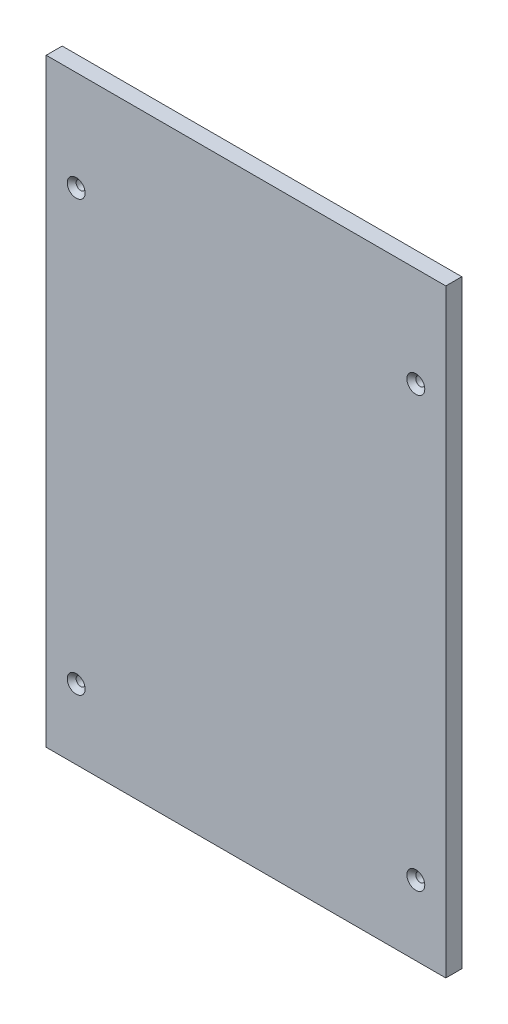
ISO-10303-21;
HEADER;
FILE_DESCRIPTION(('STEP AP214'),'2;1');
FILE_NAME('part.step','',(''),(''),'','','');
FILE_SCHEMA(('AUTOMOTIVE_DESIGN { 1 0 10303 214 1 1 1 1 }'));
ENDSEC;
DATA;
#1=APPLICATION_CONTEXT('core data for automotive mechanical design processes');
#2=APPLICATION_PROTOCOL_DEFINITION('international standard','automotive_design',2000,#1);
#3=PRODUCT_CONTEXT('',#1,'mechanical');
#4=PRODUCT('Part','Part','',(#3));
#5=PRODUCT_RELATED_PRODUCT_CATEGORY('part','',(#4));
#6=PRODUCT_DEFINITION_FORMATION('','',#4);
#7=PRODUCT_DEFINITION_CONTEXT('part definition',#1,'design');
#8=PRODUCT_DEFINITION('design','',#6,#7);
#9=PRODUCT_DEFINITION_SHAPE('','',#8);
#10=(LENGTH_UNIT() NAMED_UNIT(*) SI_UNIT(.MILLI.,.METRE.));
#11=(NAMED_UNIT(*) PLANE_ANGLE_UNIT() SI_UNIT($,.RADIAN.));
#12=(NAMED_UNIT(*) SI_UNIT($,.STERADIAN.) SOLID_ANGLE_UNIT());
#13=UNCERTAINTY_MEASURE_WITH_UNIT(LENGTH_MEASURE(1.E-05),#10,'distance_accuracy_value','');
#14=(GEOMETRIC_REPRESENTATION_CONTEXT(3) GLOBAL_UNCERTAINTY_ASSIGNED_CONTEXT((#13)) GLOBAL_UNIT_ASSIGNED_CONTEXT((#10,
#11,#12)) REPRESENTATION_CONTEXT('',''));
#15=CARTESIAN_POINT('',(0.,0.,0.));
#16=DIRECTION('',(0.,0.,1.));
#17=DIRECTION('',(1.,0.,0.));
#18=AXIS2_PLACEMENT_3D('',#15,#16,#17);
#19=CARTESIAN_POINT('',(0.,0.,8.));
#20=DIRECTION('',(1.,0.,0.));
#21=DIRECTION('',(0.,0.,-1.));
#22=AXIS2_PLACEMENT_3D('',#19,#20,#21);
#23=PLANE('',#22);
#24=DIRECTION('',(0.,-1.,0.));
#25=VECTOR('',#24,1.);
#26=CARTESIAN_POINT('',(0.,0.,0.));
#27=LINE('',#26,#25);
#28=CARTESIAN_POINT('',(0.,300.,0.));
#29=VERTEX_POINT('',#28);
#30=CARTESIAN_POINT('',(0.,0.,0.));
#31=VERTEX_POINT('',#30);
#32=EDGE_CURVE('E96',#29,#31,#27,.T.);
#33=ORIENTED_EDGE('',*,*,#32,.T.);
#34=DIRECTION('',(0.,0.,-1.));
#35=VECTOR('',#34,1.);
#36=CARTESIAN_POINT('',(0.,0.,8.));
#37=LINE('',#36,#35);
#38=CARTESIAN_POINT('',(0.,0.,8.));
#39=VERTEX_POINT('',#38);
#40=EDGE_CURVE('E11',#39,#31,#37,.T.);
#41=ORIENTED_EDGE('',*,*,#40,.F.);
#42=DIRECTION('',(0.,-1.,0.));
#43=VECTOR('',#42,1.);
#44=CARTESIAN_POINT('',(0.,0.,8.));
#45=LINE('',#44,#43);
#46=CARTESIAN_POINT('',(0.,300.,8.));
#47=VERTEX_POINT('',#46);
#48=EDGE_CURVE('E84',#47,#39,#45,.T.);
#49=ORIENTED_EDGE('',*,*,#48,.F.);
#50=DIRECTION('',(0.,0.,-1.));
#51=VECTOR('',#50,1.);
#52=CARTESIAN_POINT('',(0.,300.,8.));
#53=LINE('',#52,#51);
#54=EDGE_CURVE('E92',#47,#29,#53,.T.);
#55=ORIENTED_EDGE('',*,*,#54,.T.);
#56=EDGE_LOOP('',(#33,#41,#49,#55));
#57=FACE_BOUND('',#56,.T.);
#58=ADVANCED_FACE('F33',(#57),#23,.F.);
#59=CARTESIAN_POINT('',(0.,0.,8.));
#60=DIRECTION('',(0.,1.,0.));
#61=DIRECTION('',(0.,0.,1.));
#62=AXIS2_PLACEMENT_3D('',#59,#60,#61);
#63=PLANE('',#62);
#64=DIRECTION('',(1.,0.,0.));
#65=VECTOR('',#64,1.);
#66=CARTESIAN_POINT('',(0.,0.,0.));
#67=LINE('',#66,#65);
#68=CARTESIAN_POINT('',(200.,0.,0.));
#69=VERTEX_POINT('',#68);
#70=EDGE_CURVE('E88',#31,#69,#67,.T.);
#71=ORIENTED_EDGE('',*,*,#70,.T.);
#72=DIRECTION('',(0.,0.,-1.));
#73=VECTOR('',#72,1.);
#74=CARTESIAN_POINT('',(200.,0.,8.));
#75=LINE('',#74,#73);
#76=CARTESIAN_POINT('',(200.,0.,8.));
#77=VERTEX_POINT('',#76);
#78=EDGE_CURVE('E41',#77,#69,#75,.T.);
#79=ORIENTED_EDGE('',*,*,#78,.F.);
#80=DIRECTION('',(1.,0.,0.));
#81=VECTOR('',#80,1.);
#82=CARTESIAN_POINT('',(0.,0.,8.));
#83=LINE('',#82,#81);
#84=EDGE_CURVE('E79',#39,#77,#83,.T.);
#85=ORIENTED_EDGE('',*,*,#84,.F.);
#86=ORIENTED_EDGE('',*,*,#40,.T.);
#87=EDGE_LOOP('',(#71,#79,#85,#86));
#88=FACE_BOUND('',#87,.T.);
#89=ADVANCED_FACE('F87',(#88),#63,.F.);
#90=CARTESIAN_POINT('',(200.,0.,8.));
#91=DIRECTION('',(-1.,0.,0.));
#92=DIRECTION('',(0.,0.,1.));
#93=AXIS2_PLACEMENT_3D('',#90,#91,#92);
#94=PLANE('',#93);
#95=DIRECTION('',(0.,1.,0.));
#96=VECTOR('',#95,1.);
#97=CARTESIAN_POINT('',(200.,0.,0.));
#98=LINE('',#97,#96);
#99=CARTESIAN_POINT('',(200.,300.,0.));
#100=VERTEX_POINT('',#99);
#101=EDGE_CURVE('E66',#69,#100,#98,.T.);
#102=ORIENTED_EDGE('',*,*,#101,.T.);
#103=DIRECTION('',(0.,0.,-1.));
#104=VECTOR('',#103,1.);
#105=CARTESIAN_POINT('',(200.,300.,8.));
#106=LINE('',#105,#104);
#107=CARTESIAN_POINT('',(200.,300.,8.));
#108=VERTEX_POINT('',#107);
#109=EDGE_CURVE('E89',#108,#100,#106,.T.);
#110=ORIENTED_EDGE('',*,*,#109,.F.);
#111=DIRECTION('',(0.,1.,0.));
#112=VECTOR('',#111,1.);
#113=CARTESIAN_POINT('',(200.,0.,8.));
#114=LINE('',#113,#112);
#115=EDGE_CURVE('E82',#77,#108,#114,.T.);
#116=ORIENTED_EDGE('',*,*,#115,.F.);
#117=ORIENTED_EDGE('',*,*,#78,.T.);
#118=EDGE_LOOP('',(#102,#110,#116,#117));
#119=FACE_BOUND('',#118,.T.);
#120=ADVANCED_FACE('F90',(#119),#94,.F.);
#121=CARTESIAN_POINT('',(0.,300.,8.));
#122=DIRECTION('',(0.,-1.,0.));
#123=DIRECTION('',(0.,0.,-1.));
#124=AXIS2_PLACEMENT_3D('',#121,#122,#123);
#125=PLANE('',#124);
#126=DIRECTION('',(-1.,0.,0.));
#127=VECTOR('',#126,1.);
#128=CARTESIAN_POINT('',(0.,300.,0.));
#129=LINE('',#128,#127);
#130=EDGE_CURVE('E72',#100,#29,#129,.T.);
#131=ORIENTED_EDGE('',*,*,#130,.T.);
#132=ORIENTED_EDGE('',*,*,#54,.F.);
#133=DIRECTION('',(-1.,0.,0.));
#134=VECTOR('',#133,1.);
#135=CARTESIAN_POINT('',(0.,300.,8.));
#136=LINE('',#135,#134);
#137=EDGE_CURVE('E49',#108,#47,#136,.T.);
#138=ORIENTED_EDGE('',*,*,#137,.F.);
#139=ORIENTED_EDGE('',*,*,#109,.T.);
#140=EDGE_LOOP('',(#131,#132,#138,#139));
#141=FACE_BOUND('',#140,.T.);
#142=ADVANCED_FACE('F104',(#141),#125,.F.);
#143=CARTESIAN_POINT('',(0.,0.,8.));
#144=DIRECTION('',(0.,0.,-1.));
#145=DIRECTION('',(-1.,0.,0.));
#146=AXIS2_PLACEMENT_3D('',#143,#144,#145);
#147=PLANE('',#146);
#148=CARTESIAN_POINT('',(15.,250.,8.));
#149=DIRECTION('',(0.,0.,1.));
#150=DIRECTION('',(1.,0.,0.));
#151=AXIS2_PLACEMENT_3D('',#148,#149,#150);
#152=CIRCLE('',#151,4.48);
#153=CARTESIAN_POINT('',(19.48,250.,8.));
#154=VERTEX_POINT('',#153);
#155=EDGE_CURVE('E142',#154,#154,#152,.T.);
#156=ORIENTED_EDGE('',*,*,#155,.F.);
#157=EDGE_LOOP('',(#156));
#158=FACE_BOUND('',#157,.T.);
#159=CARTESIAN_POINT('',(185.,250.,8.));
#160=DIRECTION('',(0.,0.,1.));
#161=DIRECTION('',(1.,0.,0.));
#162=AXIS2_PLACEMENT_3D('',#159,#160,#161);
#163=CIRCLE('',#162,4.48000000000001);
#164=CARTESIAN_POINT('',(189.48,250.,8.));
#165=VERTEX_POINT('',#164);
#166=EDGE_CURVE('E133',#165,#165,#163,.T.);
#167=ORIENTED_EDGE('',*,*,#166,.F.);
#168=EDGE_LOOP('',(#167));
#169=FACE_BOUND('',#168,.T.);
#170=CARTESIAN_POINT('',(15.,35.,8.));
#171=DIRECTION('',(0.,0.,1.));
#172=DIRECTION('',(1.,0.,0.));
#173=AXIS2_PLACEMENT_3D('',#170,#171,#172);
#174=CIRCLE('',#173,4.48);
#175=CARTESIAN_POINT('',(19.48,35.,8.));
#176=VERTEX_POINT('',#175);
#177=EDGE_CURVE('E124',#176,#176,#174,.T.);
#178=ORIENTED_EDGE('',*,*,#177,.F.);
#179=EDGE_LOOP('',(#178));
#180=FACE_BOUND('',#179,.T.);
#181=CARTESIAN_POINT('',(185.,35.,8.));
#182=DIRECTION('',(0.,0.,1.));
#183=DIRECTION('',(1.,0.,0.));
#184=AXIS2_PLACEMENT_3D('',#181,#182,#183);
#185=CIRCLE('',#184,4.48000000000001);
#186=CARTESIAN_POINT('',(189.48,35.,8.));
#187=VERTEX_POINT('',#186);
#188=EDGE_CURVE('E115',#187,#187,#185,.T.);
#189=ORIENTED_EDGE('',*,*,#188,.F.);
#190=EDGE_LOOP('',(#189));
#191=FACE_BOUND('',#190,.T.);
#192=ORIENTED_EDGE('',*,*,#48,.T.);
#193=ORIENTED_EDGE('',*,*,#84,.T.);
#194=ORIENTED_EDGE('',*,*,#115,.T.);
#195=ORIENTED_EDGE('',*,*,#137,.T.);
#196=EDGE_LOOP('',(#192,#193,#194,#195));
#197=FACE_BOUND('',#196,.T.);
#198=ADVANCED_FACE('F80',(#158,#169,#180,#191,#197),#147,.F.);
#199=CARTESIAN_POINT('',(0.,0.,0.));
#200=DIRECTION('',(0.,0.,-1.));
#201=DIRECTION('',(-1.,0.,0.));
#202=AXIS2_PLACEMENT_3D('',#199,#200,#201);
#203=PLANE('',#202);
#204=CARTESIAN_POINT('',(15.,250.,0.));
#205=DIRECTION('',(0.,0.,1.));
#206=DIRECTION('',(1.,0.,0.));
#207=AXIS2_PLACEMENT_3D('',#204,#205,#206);
#208=CIRCLE('',#207,2.25);
#209=CARTESIAN_POINT('',(17.25,250.,0.));
#210=VERTEX_POINT('',#209);
#211=EDGE_CURVE('E136',#210,#210,#208,.T.);
#212=ORIENTED_EDGE('',*,*,#211,.T.);
#213=EDGE_LOOP('',(#212));
#214=FACE_BOUND('',#213,.T.);
#215=CARTESIAN_POINT('',(185.,250.,0.));
#216=DIRECTION('',(0.,0.,1.));
#217=DIRECTION('',(1.,0.,0.));
#218=AXIS2_PLACEMENT_3D('',#215,#216,#217);
#219=CIRCLE('',#218,2.25);
#220=CARTESIAN_POINT('',(187.25,250.,0.));
#221=VERTEX_POINT('',#220);
#222=EDGE_CURVE('E127',#221,#221,#219,.T.);
#223=ORIENTED_EDGE('',*,*,#222,.T.);
#224=EDGE_LOOP('',(#223));
#225=FACE_BOUND('',#224,.T.);
#226=CARTESIAN_POINT('',(15.,35.,0.));
#227=DIRECTION('',(0.,0.,1.));
#228=DIRECTION('',(1.,0.,0.));
#229=AXIS2_PLACEMENT_3D('',#226,#227,#228);
#230=CIRCLE('',#229,2.25);
#231=CARTESIAN_POINT('',(17.25,35.,0.));
#232=VERTEX_POINT('',#231);
#233=EDGE_CURVE('E118',#232,#232,#230,.T.);
#234=ORIENTED_EDGE('',*,*,#233,.T.);
#235=EDGE_LOOP('',(#234));
#236=FACE_BOUND('',#235,.T.);
#237=CARTESIAN_POINT('',(185.,35.,0.));
#238=DIRECTION('',(0.,0.,1.));
#239=DIRECTION('',(1.,0.,0.));
#240=AXIS2_PLACEMENT_3D('',#237,#238,#239);
#241=CIRCLE('',#240,2.25);
#242=CARTESIAN_POINT('',(187.25,35.,0.));
#243=VERTEX_POINT('',#242);
#244=EDGE_CURVE('E99',#243,#243,#241,.T.);
#245=ORIENTED_EDGE('',*,*,#244,.T.);
#246=EDGE_LOOP('',(#245));
#247=FACE_BOUND('',#246,.T.);
#248=ORIENTED_EDGE('',*,*,#32,.F.);
#249=ORIENTED_EDGE('',*,*,#130,.F.);
#250=ORIENTED_EDGE('',*,*,#101,.F.);
#251=ORIENTED_EDGE('',*,*,#70,.F.);
#252=EDGE_LOOP('',(#248,#249,#250,#251));
#253=FACE_BOUND('',#252,.T.);
#254=ADVANCED_FACE('F107',(#214,#225,#236,#247,#253),#203,.T.);
#255=CARTESIAN_POINT('',(185.,35.,8.));
#256=DIRECTION('',(0.,0.,1.));
#257=DIRECTION('',(1.,0.,0.));
#258=AXIS2_PLACEMENT_3D('',#255,#256,#257);
#259=CYLINDRICAL_SURFACE('',#258,2.25);
#260=ORIENTED_EDGE('',*,*,#244,.F.);
#261=EDGE_LOOP('',(#260));
#262=FACE_BOUND('',#261,.T.);
#263=CARTESIAN_POINT('',(185.,35.,5.77));
#264=DIRECTION('',(0.,0.,1.));
#265=DIRECTION('',(1.,0.,0.));
#266=AXIS2_PLACEMENT_3D('',#263,#264,#265);
#267=CIRCLE('',#266,2.25);
#268=CARTESIAN_POINT('',(187.25,35.,5.77));
#269=VERTEX_POINT('',#268);
#270=EDGE_CURVE('E112',#269,#269,#267,.T.);
#271=ORIENTED_EDGE('',*,*,#270,.T.);
#272=EDGE_LOOP('',(#271));
#273=FACE_BOUND('',#272,.T.);
#274=ADVANCED_FACE('F160',(#262,#273),#259,.F.);
#275=CARTESIAN_POINT('',(185.,35.,8.));
#276=DIRECTION('',(0.,0.,1.));
#277=DIRECTION('',(1.,0.,0.));
#278=AXIS2_PLACEMENT_3D('',#275,#276,#277);
#279=CONICAL_SURFACE('',#278,4.48000000000001,0.78539816339745);
#280=ORIENTED_EDGE('',*,*,#270,.F.);
#281=EDGE_LOOP('',(#280));
#282=FACE_BOUND('',#281,.T.);
#283=ORIENTED_EDGE('',*,*,#188,.T.);
#284=EDGE_LOOP('',(#283));
#285=FACE_BOUND('',#284,.T.);
#286=ADVANCED_FACE('F157',(#282,#285),#279,.F.);
#287=CARTESIAN_POINT('',(15.,35.,8.));
#288=DIRECTION('',(0.,0.,1.));
#289=DIRECTION('',(1.,0.,0.));
#290=AXIS2_PLACEMENT_3D('',#287,#288,#289);
#291=CYLINDRICAL_SURFACE('',#290,2.25);
#292=ORIENTED_EDGE('',*,*,#233,.F.);
#293=EDGE_LOOP('',(#292));
#294=FACE_BOUND('',#293,.T.);
#295=CARTESIAN_POINT('',(15.,35.,5.77));
#296=DIRECTION('',(0.,0.,1.));
#297=DIRECTION('',(1.,0.,0.));
#298=AXIS2_PLACEMENT_3D('',#295,#296,#297);
#299=CIRCLE('',#298,2.25);
#300=CARTESIAN_POINT('',(17.25,35.,5.77));
#301=VERTEX_POINT('',#300);
#302=EDGE_CURVE('E121',#301,#301,#299,.T.);
#303=ORIENTED_EDGE('',*,*,#302,.T.);
#304=EDGE_LOOP('',(#303));
#305=FACE_BOUND('',#304,.T.);
#306=ADVANCED_FACE('F159',(#294,#305),#291,.F.);
#307=CARTESIAN_POINT('',(15.,35.,8.));
#308=DIRECTION('',(0.,0.,1.));
#309=DIRECTION('',(1.,0.,0.));
#310=AXIS2_PLACEMENT_3D('',#307,#308,#309);
#311=CONICAL_SURFACE('',#310,4.48,0.785398163397448);
#312=ORIENTED_EDGE('',*,*,#302,.F.);
#313=EDGE_LOOP('',(#312));
#314=FACE_BOUND('',#313,.T.);
#315=ORIENTED_EDGE('',*,*,#177,.T.);
#316=EDGE_LOOP('',(#315));
#317=FACE_BOUND('',#316,.T.);
#318=ADVANCED_FACE('F167',(#314,#317),#311,.F.);
#319=CARTESIAN_POINT('',(185.,250.,8.));
#320=DIRECTION('',(0.,0.,1.));
#321=DIRECTION('',(1.,0.,0.));
#322=AXIS2_PLACEMENT_3D('',#319,#320,#321);
#323=CYLINDRICAL_SURFACE('',#322,2.25);
#324=ORIENTED_EDGE('',*,*,#222,.F.);
#325=EDGE_LOOP('',(#324));
#326=FACE_BOUND('',#325,.T.);
#327=CARTESIAN_POINT('',(185.,250.,5.77));
#328=DIRECTION('',(0.,0.,1.));
#329=DIRECTION('',(1.,0.,0.));
#330=AXIS2_PLACEMENT_3D('',#327,#328,#329);
#331=CIRCLE('',#330,2.25);
#332=CARTESIAN_POINT('',(187.25,250.,5.77));
#333=VERTEX_POINT('',#332);
#334=EDGE_CURVE('E130',#333,#333,#331,.T.);
#335=ORIENTED_EDGE('',*,*,#334,.T.);
#336=EDGE_LOOP('',(#335));
#337=FACE_BOUND('',#336,.T.);
#338=ADVANCED_FACE('F201',(#326,#337),#323,.F.);
#339=CARTESIAN_POINT('',(185.,250.,8.));
#340=DIRECTION('',(0.,0.,1.));
#341=DIRECTION('',(1.,0.,0.));
#342=AXIS2_PLACEMENT_3D('',#339,#340,#341);
#343=CONICAL_SURFACE('',#342,4.48000000000001,0.78539816339745);
#344=ORIENTED_EDGE('',*,*,#334,.F.);
#345=EDGE_LOOP('',(#344));
#346=FACE_BOUND('',#345,.T.);
#347=ORIENTED_EDGE('',*,*,#166,.T.);
#348=EDGE_LOOP('',(#347));
#349=FACE_BOUND('',#348,.T.);
#350=ADVANCED_FACE('F206',(#346,#349),#343,.F.);
#351=CARTESIAN_POINT('',(15.,250.,8.));
#352=DIRECTION('',(0.,0.,1.));
#353=DIRECTION('',(1.,0.,0.));
#354=AXIS2_PLACEMENT_3D('',#351,#352,#353);
#355=CYLINDRICAL_SURFACE('',#354,2.25);
#356=ORIENTED_EDGE('',*,*,#211,.F.);
#357=EDGE_LOOP('',(#356));
#358=FACE_BOUND('',#357,.T.);
#359=CARTESIAN_POINT('',(15.,250.,5.77));
#360=DIRECTION('',(0.,0.,1.));
#361=DIRECTION('',(1.,0.,0.));
#362=AXIS2_PLACEMENT_3D('',#359,#360,#361);
#363=CIRCLE('',#362,2.25);
#364=CARTESIAN_POINT('',(17.25,250.,5.77));
#365=VERTEX_POINT('',#364);
#366=EDGE_CURVE('E139',#365,#365,#363,.T.);
#367=ORIENTED_EDGE('',*,*,#366,.T.);
#368=EDGE_LOOP('',(#367));
#369=FACE_BOUND('',#368,.T.);
#370=ADVANCED_FACE('F212',(#358,#369),#355,.F.);
#371=CARTESIAN_POINT('',(15.,250.,8.));
#372=DIRECTION('',(0.,0.,1.));
#373=DIRECTION('',(1.,0.,0.));
#374=AXIS2_PLACEMENT_3D('',#371,#372,#373);
#375=CONICAL_SURFACE('',#374,4.48,0.785398163397449);
#376=ORIENTED_EDGE('',*,*,#366,.F.);
#377=EDGE_LOOP('',(#376));
#378=FACE_BOUND('',#377,.T.);
#379=ORIENTED_EDGE('',*,*,#155,.T.);
#380=EDGE_LOOP('',(#379));
#381=FACE_BOUND('',#380,.T.);
#382=ADVANCED_FACE('F146',(#378,#381),#375,.F.);
#383=CLOSED_SHELL('',(#58,#89,#120,#142,#198,#254,#274,#286,#306,#318,#338,#350,#370,#382));
#384=MANIFOLD_SOLID_BREP('B2',#383);
#385=ADVANCED_BREP_SHAPE_REPRESENTATION('',(#18,#384),#14);
#386=SHAPE_DEFINITION_REPRESENTATION(#9,#385);
ENDSEC;
END-ISO-10303-21;
